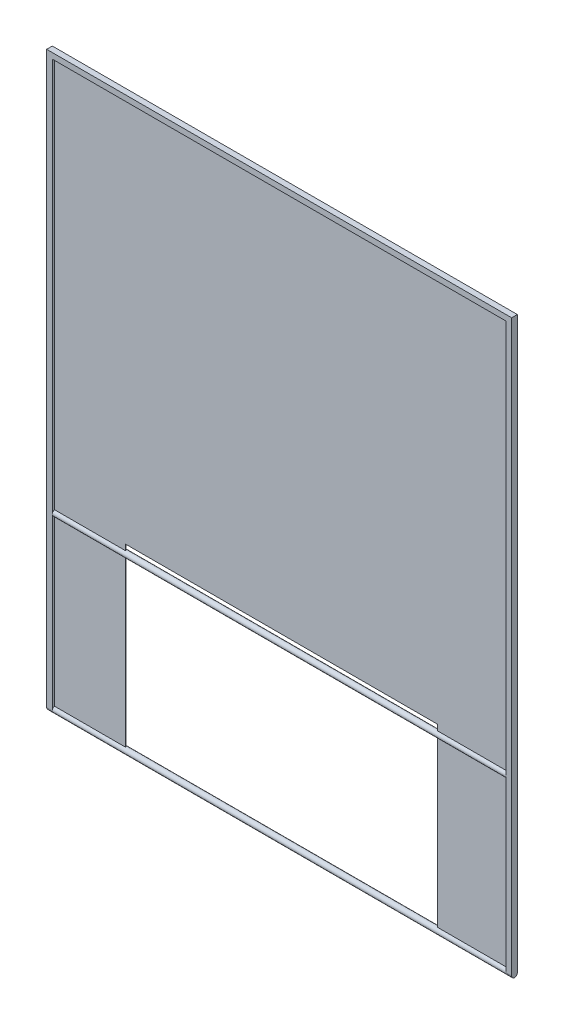
ISO-10303-21;
HEADER;
FILE_DESCRIPTION(('STEP AP214'),'2;1');
FILE_NAME('part.step','',(''),(''),'','','');
FILE_SCHEMA(('AUTOMOTIVE_DESIGN { 1 0 10303 214 1 1 1 1 }'));
ENDSEC;
DATA;
#1=APPLICATION_CONTEXT('core data for automotive mechanical design processes');
#2=APPLICATION_PROTOCOL_DEFINITION('international standard','automotive_design',2000,#1);
#3=PRODUCT_CONTEXT('',#1,'mechanical');
#4=PRODUCT('Part','Part','',(#3));
#5=PRODUCT_RELATED_PRODUCT_CATEGORY('part','',(#4));
#6=PRODUCT_DEFINITION_FORMATION('','',#4);
#7=PRODUCT_DEFINITION_CONTEXT('part definition',#1,'design');
#8=PRODUCT_DEFINITION('design','',#6,#7);
#9=PRODUCT_DEFINITION_SHAPE('','',#8);
#10=(LENGTH_UNIT() NAMED_UNIT(*) SI_UNIT(.MILLI.,.METRE.));
#11=(NAMED_UNIT(*) PLANE_ANGLE_UNIT() SI_UNIT($,.RADIAN.));
#12=(NAMED_UNIT(*) SI_UNIT($,.STERADIAN.) SOLID_ANGLE_UNIT());
#13=UNCERTAINTY_MEASURE_WITH_UNIT(LENGTH_MEASURE(1.E-05),#10,'distance_accuracy_value','');
#14=(GEOMETRIC_REPRESENTATION_CONTEXT(3) GLOBAL_UNCERTAINTY_ASSIGNED_CONTEXT((#13)) GLOBAL_UNIT_ASSIGNED_CONTEXT((#10,
#11,#12)) REPRESENTATION_CONTEXT('',''));
#15=CARTESIAN_POINT('',(0.,0.,0.));
#16=DIRECTION('',(0.,0.,1.));
#17=DIRECTION('',(1.,0.,0.));
#18=AXIS2_PLACEMENT_3D('',#15,#16,#17);
#19=CARTESIAN_POINT('',(-400.,995.,5.));
#20=DIRECTION('',(1.,0.,0.));
#21=DIRECTION('',(0.,0.,-1.));
#22=AXIS2_PLACEMENT_3D('',#19,#20,#21);
#23=PLANE('',#22);
#24=DIRECTION('',(0.,0.,-1.));
#25=VECTOR('',#24,1.);
#26=CARTESIAN_POINT('',(-400.,995.,5.));
#27=LINE('',#26,#25);
#28=CARTESIAN_POINT('',(-400.,995.,0.));
#29=VERTEX_POINT('',#28);
#30=CARTESIAN_POINT('',(-400.,995.,-5.));
#31=VERTEX_POINT('',#30);
#32=EDGE_CURVE('E433',#29,#31,#27,.T.);
#33=ORIENTED_EDGE('',*,*,#32,.F.);
#34=DIRECTION('',(0.,-1.,0.));
#35=VECTOR('',#34,1.);
#36=CARTESIAN_POINT('',(-400.,995.,0.));
#37=LINE('',#36,#35);
#38=CARTESIAN_POINT('',(-400.,305.,0.));
#39=VERTEX_POINT('',#38);
#40=EDGE_CURVE('E302',#29,#39,#37,.T.);
#41=ORIENTED_EDGE('',*,*,#40,.T.);
#42=CARTESIAN_POINT('',(-400.,300.,0.));
#43=DIRECTION('',(1.,0.,0.));
#44=DIRECTION('',(0.,0.,-1.));
#45=AXIS2_PLACEMENT_3D('',#42,#43,#44);
#46=CIRCLE('',#45,5.);
#47=CARTESIAN_POINT('',(-400.,300.,-5.));
#48=VERTEX_POINT('',#47);
#49=EDGE_CURVE('E354',#48,#39,#46,.T.);
#50=ORIENTED_EDGE('',*,*,#49,.F.);
#51=DIRECTION('',(0.,-1.,0.));
#52=VECTOR('',#51,1.);
#53=CARTESIAN_POINT('',(-400.,995.,-5.));
#54=LINE('',#53,#52);
#55=EDGE_CURVE('E402',#31,#48,#54,.T.);
#56=ORIENTED_EDGE('',*,*,#55,.F.);
#57=EDGE_LOOP('',(#33,#41,#50,#56));
#58=FACE_BOUND('',#57,.T.);
#59=ADVANCED_FACE('F51',(#58),#23,.T.);
#60=CARTESIAN_POINT('',(400.,-5.,5.));
#61=DIRECTION('',(-1.,0.,0.));
#62=DIRECTION('',(0.,0.,1.));
#63=AXIS2_PLACEMENT_3D('',#60,#61,#62);
#64=PLANE('',#63);
#65=CARTESIAN_POINT('',(400.,300.,0.));
#66=DIRECTION('',(1.,0.,0.));
#67=DIRECTION('',(0.,0.,-1.));
#68=AXIS2_PLACEMENT_3D('',#65,#66,#67);
#69=CIRCLE('',#68,5.);
#70=CARTESIAN_POINT('',(400.,300.,-5.));
#71=VERTEX_POINT('',#70);
#72=CARTESIAN_POINT('',(400.,305.,0.));
#73=VERTEX_POINT('',#72);
#74=EDGE_CURVE('E362',#71,#73,#69,.T.);
#75=ORIENTED_EDGE('',*,*,#74,.T.);
#76=DIRECTION('',(0.,1.,0.));
#77=VECTOR('',#76,1.);
#78=CARTESIAN_POINT('',(400.,-5.,0.));
#79=LINE('',#78,#77);
#80=CARTESIAN_POINT('',(400.,995.,0.));
#81=VERTEX_POINT('',#80);
#82=EDGE_CURVE('E293',#73,#81,#79,.T.);
#83=ORIENTED_EDGE('',*,*,#82,.T.);
#84=DIRECTION('',(0.,0.,-1.));
#85=VECTOR('',#84,1.);
#86=CARTESIAN_POINT('',(400.,995.,5.));
#87=LINE('',#86,#85);
#88=CARTESIAN_POINT('',(400.,995.,-5.));
#89=VERTEX_POINT('',#88);
#90=EDGE_CURVE('E428',#81,#89,#87,.T.);
#91=ORIENTED_EDGE('',*,*,#90,.T.);
#92=DIRECTION('',(0.,1.,0.));
#93=VECTOR('',#92,1.);
#94=CARTESIAN_POINT('',(400.,-5.,-5.));
#95=LINE('',#94,#93);
#96=EDGE_CURVE('E411',#71,#89,#95,.T.);
#97=ORIENTED_EDGE('',*,*,#96,.F.);
#98=EDGE_LOOP('',(#75,#83,#91,#97));
#99=FACE_BOUND('',#98,.T.);
#100=ADVANCED_FACE('F565',(#99),#64,.T.);
#101=CARTESIAN_POINT('',(-400.,295.,0.));
#102=VERTEX_POINT('',#101);
#103=EDGE_CURVE('E360',#102,#48,#46,.T.);
#104=ORIENTED_EDGE('',*,*,#103,.F.);
#105=DIRECTION('',(0.,-1.,0.));
#106=VECTOR('',#105,1.);
#107=CARTESIAN_POINT('',(-400.,995.,0.));
#108=LINE('',#107,#106);
#109=CARTESIAN_POINT('',(-400.,5.,0.));
#110=VERTEX_POINT('',#109);
#111=EDGE_CURVE('E76',#102,#110,#108,.T.);
#112=ORIENTED_EDGE('',*,*,#111,.T.);
#113=CARTESIAN_POINT('',(-400.,0.,0.));
#114=DIRECTION('',(1.,0.,0.));
#115=DIRECTION('',(0.,0.,-1.));
#116=AXIS2_PLACEMENT_3D('',#113,#114,#115);
#117=CIRCLE('',#116,5.);
#118=CARTESIAN_POINT('',(-400.,0.,-5.));
#119=VERTEX_POINT('',#118);
#120=EDGE_CURVE('E442',#119,#110,#117,.T.);
#121=ORIENTED_EDGE('',*,*,#120,.F.);
#122=EDGE_CURVE('E407',#48,#119,#54,.T.);
#123=ORIENTED_EDGE('',*,*,#122,.F.);
#124=EDGE_LOOP('',(#104,#112,#121,#123));
#125=FACE_BOUND('',#124,.T.);
#126=ADVANCED_FACE('F536',(#125),#23,.T.);
#127=CARTESIAN_POINT('',(400.,995.,5.));
#128=DIRECTION('',(0.,-1.,0.));
#129=DIRECTION('',(1.,0.,0.));
#130=AXIS2_PLACEMENT_3D('',#127,#128,#129);
#131=PLANE('',#130);
#132=ORIENTED_EDGE('',*,*,#90,.F.);
#133=DIRECTION('',(-1.,0.,0.));
#134=VECTOR('',#133,1.);
#135=CARTESIAN_POINT('',(400.,995.,0.));
#136=LINE('',#135,#134);
#137=EDGE_CURVE('E298',#81,#29,#136,.T.);
#138=ORIENTED_EDGE('',*,*,#137,.T.);
#139=ORIENTED_EDGE('',*,*,#32,.T.);
#140=DIRECTION('',(-1.,0.,0.));
#141=VECTOR('',#140,1.);
#142=CARTESIAN_POINT('',(400.,995.,-5.));
#143=LINE('',#142,#141);
#144=EDGE_CURVE('E406',#89,#31,#143,.T.);
#145=ORIENTED_EDGE('',*,*,#144,.F.);
#146=EDGE_LOOP('',(#132,#138,#139,#145));
#147=FACE_BOUND('',#146,.T.);
#148=ADVANCED_FACE('F543',(#147),#131,.T.);
#149=CARTESIAN_POINT('',(400.,0.,0.));
#150=DIRECTION('',(1.,0.,0.));
#151=DIRECTION('',(0.,0.,-1.));
#152=AXIS2_PLACEMENT_3D('',#149,#150,#151);
#153=CIRCLE('',#152,5.);
#154=CARTESIAN_POINT('',(400.,0.,-5.));
#155=VERTEX_POINT('',#154);
#156=CARTESIAN_POINT('',(400.,5.,0.));
#157=VERTEX_POINT('',#156);
#158=EDGE_CURVE('E449',#155,#157,#153,.T.);
#159=ORIENTED_EDGE('',*,*,#158,.T.);
#160=DIRECTION('',(0.,1.,0.));
#161=VECTOR('',#160,1.);
#162=CARTESIAN_POINT('',(400.,-5.,0.));
#163=LINE('',#162,#161);
#164=CARTESIAN_POINT('',(400.,295.,0.));
#165=VERTEX_POINT('',#164);
#166=EDGE_CURVE('E317',#157,#165,#163,.T.);
#167=ORIENTED_EDGE('',*,*,#166,.T.);
#168=EDGE_CURVE('E358',#165,#71,#69,.T.);
#169=ORIENTED_EDGE('',*,*,#168,.T.);
#170=EDGE_CURVE('E415',#155,#71,#95,.T.);
#171=ORIENTED_EDGE('',*,*,#170,.F.);
#172=EDGE_LOOP('',(#159,#167,#169,#171));
#173=FACE_BOUND('',#172,.T.);
#174=ADVANCED_FACE('F561',(#173),#64,.T.);
#175=DIRECTION('',(0.,-1.,0.));
#176=VECTOR('',#175,1.);
#177=CARTESIAN_POINT('',(-400.,995.,1.));
#178=LINE('',#177,#176);
#179=CARTESIAN_POINT('',(-400.,995.,1.));
#180=VERTEX_POINT('',#179);
#181=CARTESIAN_POINT('',(-400.,304.898979485566,1.));
#182=VERTEX_POINT('',#181);
#183=EDGE_CURVE('E330',#180,#182,#178,.T.);
#184=ORIENTED_EDGE('',*,*,#183,.F.);
#185=CARTESIAN_POINT('',(-400.,995.,5.));
#186=VERTEX_POINT('',#185);
#187=EDGE_CURVE('E434',#186,#180,#27,.T.);
#188=ORIENTED_EDGE('',*,*,#187,.F.);
#189=DIRECTION('',(0.,-1.,0.));
#190=VECTOR('',#189,1.);
#191=CARTESIAN_POINT('',(-400.,995.,5.));
#192=LINE('',#191,#190);
#193=CARTESIAN_POINT('',(-400.,300.,5.));
#194=VERTEX_POINT('',#193);
#195=EDGE_CURVE('E375',#186,#194,#192,.T.);
#196=ORIENTED_EDGE('',*,*,#195,.T.);
#197=EDGE_CURVE('E359',#182,#194,#46,.T.);
#198=ORIENTED_EDGE('',*,*,#197,.F.);
#199=EDGE_LOOP('',(#184,#188,#196,#198));
#200=FACE_BOUND('',#199,.T.);
#201=ADVANCED_FACE('F651',(#200),#23,.T.);
#202=DIRECTION('',(0.,1.,0.));
#203=VECTOR('',#202,1.);
#204=CARTESIAN_POINT('',(400.,-5.,1.));
#205=LINE('',#204,#203);
#206=CARTESIAN_POINT('',(400.,304.898979485566,1.));
#207=VERTEX_POINT('',#206);
#208=CARTESIAN_POINT('',(400.,995.,1.));
#209=VERTEX_POINT('',#208);
#210=EDGE_CURVE('E324',#207,#209,#205,.T.);
#211=ORIENTED_EDGE('',*,*,#210,.F.);
#212=CARTESIAN_POINT('',(400.,300.,5.));
#213=VERTEX_POINT('',#212);
#214=EDGE_CURVE('E367',#207,#213,#69,.T.);
#215=ORIENTED_EDGE('',*,*,#214,.T.);
#216=DIRECTION('',(0.,1.,0.));
#217=VECTOR('',#216,1.);
#218=CARTESIAN_POINT('',(400.,-5.,5.));
#219=LINE('',#218,#217);
#220=CARTESIAN_POINT('',(400.,995.,5.));
#221=VERTEX_POINT('',#220);
#222=EDGE_CURVE('E383',#213,#221,#219,.T.);
#223=ORIENTED_EDGE('',*,*,#222,.T.);
#224=EDGE_CURVE('E429',#221,#209,#87,.T.);
#225=ORIENTED_EDGE('',*,*,#224,.T.);
#226=EDGE_LOOP('',(#211,#215,#223,#225));
#227=FACE_BOUND('',#226,.T.);
#228=ADVANCED_FACE('F659',(#227),#64,.T.);
#229=CARTESIAN_POINT('',(-400.,-5.,-5.));
#230=VERTEX_POINT('',#229);
#231=EDGE_CURVE('E401',#119,#230,#54,.T.);
#232=ORIENTED_EDGE('',*,*,#231,.F.);
#233=CARTESIAN_POINT('',(-400.,-5.,0.));
#234=VERTEX_POINT('',#233);
#235=EDGE_CURVE('E441',#234,#119,#117,.T.);
#236=ORIENTED_EDGE('',*,*,#235,.F.);
#237=DIRECTION('',(0.,0.,-1.));
#238=VECTOR('',#237,1.);
#239=CARTESIAN_POINT('',(-400.,-5.,5.));
#240=LINE('',#239,#238);
#241=EDGE_CURVE('E438',#234,#230,#240,.T.);
#242=ORIENTED_EDGE('',*,*,#241,.T.);
#243=EDGE_LOOP('',(#232,#236,#242));
#244=FACE_BOUND('',#243,.T.);
#245=ADVANCED_FACE('F640',(#244),#23,.T.);
#246=CARTESIAN_POINT('',(-410.,995.,5.));
#247=DIRECTION('',(1.,0.,0.));
#248=DIRECTION('',(0.,0.,-1.));
#249=AXIS2_PLACEMENT_3D('',#246,#247,#248);
#250=PLANE('',#249);
#251=DIRECTION('',(0.,0.,-1.));
#252=VECTOR('',#251,1.);
#253=CARTESIAN_POINT('',(-410.,1005.,5.));
#254=LINE('',#253,#252);
#255=CARTESIAN_POINT('',(-410.,1005.,5.));
#256=VERTEX_POINT('',#255);
#257=CARTESIAN_POINT('',(-410.,1005.,-5.));
#258=VERTEX_POINT('',#257);
#259=EDGE_CURVE('E393',#256,#258,#254,.T.);
#260=ORIENTED_EDGE('',*,*,#259,.T.);
#261=DIRECTION('',(0.,1.,0.));
#262=VECTOR('',#261,1.);
#263=CARTESIAN_POINT('',(-410.,995.,-5.));
#264=LINE('',#263,#262);
#265=CARTESIAN_POINT('',(-410.,0.,-5.));
#266=VERTEX_POINT('',#265);
#267=EDGE_CURVE('E366',#258,#266,#264,.F.);
#268=ORIENTED_EDGE('',*,*,#267,.T.);
#269=DIRECTION('',(0.,0.,-1.));
#270=VECTOR('',#269,1.);
#271=CARTESIAN_POINT('',(-410.,0.,5.));
#272=LINE('',#271,#270);
#273=CARTESIAN_POINT('',(-410.,0.,5.));
#274=VERTEX_POINT('',#273);
#275=EDGE_CURVE('E482',#266,#274,#272,.F.);
#276=ORIENTED_EDGE('',*,*,#275,.T.);
#277=DIRECTION('',(0.,1.,0.));
#278=VECTOR('',#277,1.);
#279=CARTESIAN_POINT('',(-410.,995.,5.));
#280=LINE('',#279,#278);
#281=EDGE_CURVE('E369',#256,#274,#280,.F.);
#282=ORIENTED_EDGE('',*,*,#281,.F.);
#283=EDGE_LOOP('',(#260,#268,#276,#282));
#284=FACE_BOUND('',#283,.T.);
#285=ADVANCED_FACE('F666',(#284),#250,.F.);
#286=CARTESIAN_POINT('',(-400.,-5.,5.));
#287=DIRECTION('',(0.,-1.,0.));
#288=DIRECTION('',(1.,0.,0.));
#289=AXIS2_PLACEMENT_3D('',#286,#287,#288);
#290=PLANE('',#289);
#291=DIRECTION('',(-1.,0.,0.));
#292=VECTOR('',#291,1.);
#293=CARTESIAN_POINT('',(-400.,-5.,0.));
#294=LINE('',#293,#292);
#295=CARTESIAN_POINT('',(-405.,-5.,0.));
#296=VERTEX_POINT('',#295);
#297=EDGE_CURVE('E475',#234,#296,#294,.T.);
#298=ORIENTED_EDGE('',*,*,#297,.T.);
#299=DIRECTION('',(0.,0.,-1.));
#300=VECTOR('',#299,1.);
#301=CARTESIAN_POINT('',(-405.,-5.,-5.));
#302=LINE('',#301,#300);
#303=CARTESIAN_POINT('',(-405.,-5.,-5.));
#304=VERTEX_POINT('',#303);
#305=EDGE_CURVE('E478',#296,#304,#302,.T.);
#306=ORIENTED_EDGE('',*,*,#305,.T.);
#307=DIRECTION('',(-1.,0.,0.));
#308=VECTOR('',#307,1.);
#309=CARTESIAN_POINT('',(-400.,-5.,-5.));
#310=LINE('',#309,#308);
#311=EDGE_CURVE('E397',#230,#304,#310,.T.);
#312=ORIENTED_EDGE('',*,*,#311,.F.);
#313=ORIENTED_EDGE('',*,*,#241,.F.);
#314=EDGE_LOOP('',(#298,#306,#312,#313));
#315=FACE_BOUND('',#314,.T.);
#316=ADVANCED_FACE('F635',(#315),#290,.T.);
#317=DIRECTION('',(0.,-1.,0.));
#318=VECTOR('',#317,1.);
#319=CARTESIAN_POINT('',(-400.,995.,1.));
#320=LINE('',#319,#318);
#321=CARTESIAN_POINT('',(-400.,295.101020514434,1.));
#322=VERTEX_POINT('',#321);
#323=CARTESIAN_POINT('',(-400.,4.89897948556636,1.));
#324=VERTEX_POINT('',#323);
#325=EDGE_CURVE('E336',#322,#324,#320,.T.);
#326=ORIENTED_EDGE('',*,*,#325,.F.);
#327=EDGE_CURVE('E361',#194,#322,#46,.T.);
#328=ORIENTED_EDGE('',*,*,#327,.F.);
#329=CARTESIAN_POINT('',(-400.,0.,5.));
#330=VERTEX_POINT('',#329);
#331=EDGE_CURVE('E373',#194,#330,#192,.T.);
#332=ORIENTED_EDGE('',*,*,#331,.T.);
#333=EDGE_CURVE('E447',#324,#330,#117,.T.);
#334=ORIENTED_EDGE('',*,*,#333,.F.);
#335=EDGE_LOOP('',(#326,#328,#332,#334));
#336=FACE_BOUND('',#335,.T.);
#337=ADVANCED_FACE('F646',(#336),#23,.T.);
#338=DIRECTION('',(-1.,0.,0.));
#339=VECTOR('',#338,1.);
#340=CARTESIAN_POINT('',(400.,995.,1.));
#341=LINE('',#340,#339);
#342=EDGE_CURVE('E327',#209,#180,#341,.T.);
#343=ORIENTED_EDGE('',*,*,#342,.F.);
#344=ORIENTED_EDGE('',*,*,#224,.F.);
#345=DIRECTION('',(-1.,0.,0.));
#346=VECTOR('',#345,1.);
#347=CARTESIAN_POINT('',(400.,995.,5.));
#348=LINE('',#347,#346);
#349=EDGE_CURVE('E379',#221,#186,#348,.T.);
#350=ORIENTED_EDGE('',*,*,#349,.T.);
#351=ORIENTED_EDGE('',*,*,#187,.T.);
#352=EDGE_LOOP('',(#343,#344,#350,#351));
#353=FACE_BOUND('',#352,.T.);
#354=ADVANCED_FACE('F654',(#353),#131,.T.);
#355=DIRECTION('',(0.,1.,0.));
#356=VECTOR('',#355,1.);
#357=CARTESIAN_POINT('',(400.,-5.,1.));
#358=LINE('',#357,#356);
#359=CARTESIAN_POINT('',(400.,4.89897948556636,1.));
#360=VERTEX_POINT('',#359);
#361=CARTESIAN_POINT('',(400.,295.101020514434,1.));
#362=VERTEX_POINT('',#361);
#363=EDGE_CURVE('E344',#360,#362,#358,.T.);
#364=ORIENTED_EDGE('',*,*,#363,.F.);
#365=CARTESIAN_POINT('',(400.,0.,5.));
#366=VERTEX_POINT('',#365);
#367=EDGE_CURVE('E454',#360,#366,#153,.T.);
#368=ORIENTED_EDGE('',*,*,#367,.T.);
#369=EDGE_CURVE('E386',#366,#213,#219,.T.);
#370=ORIENTED_EDGE('',*,*,#369,.T.);
#371=EDGE_CURVE('E368',#213,#362,#69,.T.);
#372=ORIENTED_EDGE('',*,*,#371,.T.);
#373=EDGE_LOOP('',(#364,#368,#370,#372));
#374=FACE_BOUND('',#373,.T.);
#375=ADVANCED_FACE('F593',(#374),#64,.T.);
#376=CARTESIAN_POINT('',(410.,-5.,5.));
#377=DIRECTION('',(-1.,0.,0.));
#378=DIRECTION('',(0.,0.,1.));
#379=AXIS2_PLACEMENT_3D('',#376,#377,#378);
#380=PLANE('',#379);
#381=DIRECTION('',(0.,1.,0.));
#382=VECTOR('',#381,1.);
#383=CARTESIAN_POINT('',(410.,-5.,-5.));
#384=LINE('',#383,#382);
#385=CARTESIAN_POINT('',(410.,0.,-5.));
#386=VERTEX_POINT('',#385);
#387=CARTESIAN_POINT('',(410.,1005.,-5.));
#388=VERTEX_POINT('',#387);
#389=EDGE_CURVE('E416',#386,#388,#384,.T.);
#390=ORIENTED_EDGE('',*,*,#389,.T.);
#391=DIRECTION('',(0.,0.,-1.));
#392=VECTOR('',#391,1.);
#393=CARTESIAN_POINT('',(410.,1005.,5.));
#394=LINE('',#393,#392);
#395=CARTESIAN_POINT('',(410.,1005.,5.));
#396=VERTEX_POINT('',#395);
#397=EDGE_CURVE('E425',#396,#388,#394,.T.);
#398=ORIENTED_EDGE('',*,*,#397,.F.);
#399=DIRECTION('',(0.,1.,0.));
#400=VECTOR('',#399,1.);
#401=CARTESIAN_POINT('',(410.,-5.,5.));
#402=LINE('',#401,#400);
#403=CARTESIAN_POINT('',(410.,0.,5.));
#404=VERTEX_POINT('',#403);
#405=EDGE_CURVE('E387',#404,#396,#402,.T.);
#406=ORIENTED_EDGE('',*,*,#405,.F.);
#407=CARTESIAN_POINT('',(410.,0.,0.));
#408=DIRECTION('',(-1.,0.,0.));
#409=DIRECTION('',(0.,0.,1.));
#410=AXIS2_PLACEMENT_3D('',#407,#408,#409);
#411=CIRCLE('',#410,5.);
#412=CARTESIAN_POINT('',(410.,-5.,0.));
#413=VERTEX_POINT('',#412);
#414=EDGE_CURVE('E462',#404,#413,#411,.F.);
#415=ORIENTED_EDGE('',*,*,#414,.T.);
#416=CARTESIAN_POINT('',(410.,0.,0.));
#417=DIRECTION('',(-1.,0.,0.));
#418=DIRECTION('',(0.,0.,1.));
#419=AXIS2_PLACEMENT_3D('',#416,#417,#418);
#420=CIRCLE('',#419,5.);
#421=EDGE_CURVE('E465',#413,#386,#420,.F.);
#422=ORIENTED_EDGE('',*,*,#421,.T.);
#423=EDGE_LOOP('',(#390,#398,#406,#415,#422));
#424=FACE_BOUND('',#423,.T.);
#425=ADVANCED_FACE('F615',(#424),#380,.F.);
#426=CARTESIAN_POINT('',(400.,1005.,5.));
#427=DIRECTION('',(0.,-1.,0.));
#428=DIRECTION('',(1.,0.,0.));
#429=AXIS2_PLACEMENT_3D('',#426,#427,#428);
#430=PLANE('',#429);
#431=ORIENTED_EDGE('',*,*,#397,.T.);
#432=DIRECTION('',(-1.,0.,0.));
#433=VECTOR('',#432,1.);
#434=CARTESIAN_POINT('',(400.,1005.,-5.));
#435=LINE('',#434,#433);
#436=EDGE_CURVE('E374',#388,#258,#435,.T.);
#437=ORIENTED_EDGE('',*,*,#436,.T.);
#438=ORIENTED_EDGE('',*,*,#259,.F.);
#439=DIRECTION('',(-1.,0.,0.));
#440=VECTOR('',#439,1.);
#441=CARTESIAN_POINT('',(400.,1005.,5.));
#442=LINE('',#441,#440);
#443=EDGE_CURVE('E390',#396,#256,#442,.T.);
#444=ORIENTED_EDGE('',*,*,#443,.F.);
#445=EDGE_LOOP('',(#431,#437,#438,#444));
#446=FACE_BOUND('',#445,.T.);
#447=ADVANCED_FACE('F620',(#446),#430,.F.);
#448=CARTESIAN_POINT('',(0.,0.,5.));
#449=DIRECTION('',(0.,0.,1.));
#450=DIRECTION('',(1.,0.,0.));
#451=AXIS2_PLACEMENT_3D('',#448,#449,#450);
#452=PLANE('',#451);
#453=ORIENTED_EDGE('',*,*,#369,.F.);
#454=DIRECTION('',(-1.,0.,0.));
#455=VECTOR('',#454,1.);
#456=CARTESIAN_POINT('',(0.,0.,5.));
#457=LINE('',#456,#455);
#458=EDGE_CURVE('E472',#366,#404,#457,.F.);
#459=ORIENTED_EDGE('',*,*,#458,.T.);
#460=ORIENTED_EDGE('',*,*,#405,.T.);
#461=ORIENTED_EDGE('',*,*,#443,.T.);
#462=ORIENTED_EDGE('',*,*,#281,.T.);
#463=DIRECTION('',(-1.,0.,0.));
#464=VECTOR('',#463,1.);
#465=CARTESIAN_POINT('',(0.,0.,5.));
#466=LINE('',#465,#464);
#467=EDGE_CURVE('E468',#274,#330,#466,.F.);
#468=ORIENTED_EDGE('',*,*,#467,.T.);
#469=ORIENTED_EDGE('',*,*,#331,.F.);
#470=ORIENTED_EDGE('',*,*,#195,.F.);
#471=ORIENTED_EDGE('',*,*,#349,.F.);
#472=ORIENTED_EDGE('',*,*,#222,.F.);
#473=EDGE_LOOP('',(#453,#459,#460,#461,#462,#468,#469,#470,#471,#472));
#474=FACE_BOUND('',#473,.T.);
#475=ADVANCED_FACE('F611',(#474),#452,.T.);
#476=CARTESIAN_POINT('',(0.,0.,-5.));
#477=DIRECTION('',(0.,0.,1.));
#478=DIRECTION('',(1.,0.,0.));
#479=AXIS2_PLACEMENT_3D('',#476,#477,#478);
#480=PLANE('',#479);
#481=ORIENTED_EDGE('',*,*,#389,.F.);
#482=DIRECTION('',(-1.,0.,0.));
#483=VECTOR('',#482,1.);
#484=CARTESIAN_POINT('',(400.,0.,-5.));
#485=LINE('',#484,#483);
#486=EDGE_CURVE('E458',#386,#155,#485,.T.);
#487=ORIENTED_EDGE('',*,*,#486,.T.);
#488=ORIENTED_EDGE('',*,*,#170,.T.);
#489=ORIENTED_EDGE('',*,*,#96,.T.);
#490=ORIENTED_EDGE('',*,*,#144,.T.);
#491=ORIENTED_EDGE('',*,*,#55,.T.);
#492=ORIENTED_EDGE('',*,*,#122,.T.);
#493=ORIENTED_EDGE('',*,*,#231,.T.);
#494=ORIENTED_EDGE('',*,*,#311,.T.);
#495=CARTESIAN_POINT('',(-405.,0.,-5.));
#496=DIRECTION('',(0.,0.,1.));
#497=DIRECTION('',(1.,0.,0.));
#498=AXIS2_PLACEMENT_3D('',#495,#496,#497);
#499=CIRCLE('',#498,5.);
#500=EDGE_CURVE('E453',#304,#266,#499,.F.);
#501=ORIENTED_EDGE('',*,*,#500,.T.);
#502=ORIENTED_EDGE('',*,*,#267,.F.);
#503=ORIENTED_EDGE('',*,*,#436,.F.);
#504=EDGE_LOOP('',(#481,#487,#488,#489,#490,#491,#492,#493,#494,#501,#502,#503));
#505=FACE_BOUND('',#504,.T.);
#506=ADVANCED_FACE('F530',(#505),#480,.F.);
#507=CARTESIAN_POINT('',(-400.,0.,0.));
#508=DIRECTION('',(1.,0.,0.));
#509=DIRECTION('',(0.,0.,-1.));
#510=AXIS2_PLACEMENT_3D('',#507,#508,#509);
#511=CYLINDRICAL_SURFACE('',#510,5.);
#512=DIRECTION('',(1.,0.,0.));
#513=VECTOR('',#512,1.);
#514=CARTESIAN_POINT('',(-400.,4.89897948556636,1.));
#515=LINE('',#514,#513);
#516=CARTESIAN_POINT('',(-275.,4.89897948556633,1.));
#517=VERTEX_POINT('',#516);
#518=EDGE_CURVE('E340',#324,#517,#515,.T.);
#519=ORIENTED_EDGE('',*,*,#518,.F.);
#520=ORIENTED_EDGE('',*,*,#333,.T.);
#521=EDGE_CURVE('E448',#330,#234,#117,.T.);
#522=ORIENTED_EDGE('',*,*,#521,.T.);
#523=ORIENTED_EDGE('',*,*,#235,.T.);
#524=ORIENTED_EDGE('',*,*,#120,.T.);
#525=DIRECTION('',(1.,0.,0.));
#526=VECTOR('',#525,1.);
#527=CARTESIAN_POINT('',(-400.,5.,0.));
#528=LINE('',#527,#526);
#529=CARTESIAN_POINT('',(-275.,5.,0.));
#530=VERTEX_POINT('',#529);
#531=EDGE_CURVE('E312',#110,#530,#528,.T.);
#532=ORIENTED_EDGE('',*,*,#531,.T.);
#533=CARTESIAN_POINT('',(-275.,0.,0.));
#534=DIRECTION('',(1.,0.,0.));
#535=DIRECTION('',(0.,0.,-1.));
#536=AXIS2_PLACEMENT_3D('',#533,#534,#535);
#537=CIRCLE('',#536,5.);
#538=EDGE_CURVE('E350',#517,#530,#537,.F.);
#539=ORIENTED_EDGE('',*,*,#538,.F.);
#540=EDGE_LOOP('',(#519,#520,#522,#523,#524,#532,#539));
#541=FACE_BOUND('',#540,.T.);
#542=CARTESIAN_POINT('',(275.,4.89897948556636,1.));
#543=VERTEX_POINT('',#542);
#544=EDGE_CURVE('E343',#543,#360,#515,.T.);
#545=ORIENTED_EDGE('',*,*,#544,.F.);
#546=CARTESIAN_POINT('',(275.,0.,0.));
#547=DIRECTION('',(-1.,0.,0.));
#548=DIRECTION('',(0.,0.,1.));
#549=AXIS2_PLACEMENT_3D('',#546,#547,#548);
#550=CIRCLE('',#549,5.);
#551=CARTESIAN_POINT('',(275.,5.,0.));
#552=VERTEX_POINT('',#551);
#553=EDGE_CURVE('E347',#552,#543,#550,.F.);
#554=ORIENTED_EDGE('',*,*,#553,.F.);
#555=EDGE_CURVE('E316',#552,#157,#528,.T.);
#556=ORIENTED_EDGE('',*,*,#555,.T.);
#557=ORIENTED_EDGE('',*,*,#158,.F.);
#558=CARTESIAN_POINT('',(400.,-5.,0.));
#559=VERTEX_POINT('',#558);
#560=EDGE_CURVE('E446',#559,#155,#153,.T.);
#561=ORIENTED_EDGE('',*,*,#560,.F.);
#562=EDGE_CURVE('E455',#366,#559,#153,.T.);
#563=ORIENTED_EDGE('',*,*,#562,.F.);
#564=ORIENTED_EDGE('',*,*,#367,.F.);
#565=EDGE_LOOP('',(#545,#554,#556,#557,#561,#563,#564));
#566=FACE_BOUND('',#565,.T.);
#567=ADVANCED_FACE('F595',(#541,#566),#511,.T.);
#568=CARTESIAN_POINT('',(-400.,300.,0.));
#569=DIRECTION('',(1.,0.,0.));
#570=DIRECTION('',(0.,0.,-1.));
#571=AXIS2_PLACEMENT_3D('',#568,#569,#570);
#572=CYLINDRICAL_SURFACE('',#571,5.);
#573=DIRECTION('',(1.,0.,0.));
#574=VECTOR('',#573,1.);
#575=CARTESIAN_POINT('',(-400.,295.101020514434,1.));
#576=LINE('',#575,#574);
#577=CARTESIAN_POINT('',(275.,295.101020514434,1.));
#578=VERTEX_POINT('',#577);
#579=EDGE_CURVE('E337',#362,#578,#576,.F.);
#580=ORIENTED_EDGE('',*,*,#579,.F.);
#581=ORIENTED_EDGE('',*,*,#371,.F.);
#582=ORIENTED_EDGE('',*,*,#214,.F.);
#583=DIRECTION('',(1.,0.,0.));
#584=VECTOR('',#583,1.);
#585=CARTESIAN_POINT('',(-400.,304.898979485566,1.));
#586=LINE('',#585,#584);
#587=CARTESIAN_POINT('',(275.,304.898979485566,1.));
#588=VERTEX_POINT('',#587);
#589=EDGE_CURVE('E321',#588,#207,#586,.T.);
#590=ORIENTED_EDGE('',*,*,#589,.F.);
#591=CARTESIAN_POINT('',(275.,300.,0.));
#592=DIRECTION('',(-1.,0.,0.));
#593=DIRECTION('',(0.,0.,1.));
#594=AXIS2_PLACEMENT_3D('',#591,#592,#593);
#595=CIRCLE('',#594,5.);
#596=CARTESIAN_POINT('',(275.,305.,0.));
#597=VERTEX_POINT('',#596);
#598=EDGE_CURVE('E62',#597,#588,#595,.F.);
#599=ORIENTED_EDGE('',*,*,#598,.F.);
#600=DIRECTION('',(1.,0.,0.));
#601=VECTOR('',#600,1.);
#602=CARTESIAN_POINT('',(-400.,305.,0.));
#603=LINE('',#602,#601);
#604=EDGE_CURVE('E256',#597,#73,#603,.T.);
#605=ORIENTED_EDGE('',*,*,#604,.T.);
#606=ORIENTED_EDGE('',*,*,#74,.F.);
#607=ORIENTED_EDGE('',*,*,#168,.F.);
#608=DIRECTION('',(1.,0.,0.));
#609=VECTOR('',#608,1.);
#610=CARTESIAN_POINT('',(-400.,295.,0.));
#611=LINE('',#610,#609);
#612=CARTESIAN_POINT('',(275.,295.,0.));
#613=VERTEX_POINT('',#612);
#614=EDGE_CURVE('E309',#165,#613,#611,.F.);
#615=ORIENTED_EDGE('',*,*,#614,.T.);
#616=EDGE_CURVE('E12',#578,#613,#595,.F.);
#617=ORIENTED_EDGE('',*,*,#616,.F.);
#618=EDGE_LOOP('',(#580,#581,#582,#590,#599,#605,#606,#607,#615,#617));
#619=FACE_BOUND('',#618,.T.);
#620=CARTESIAN_POINT('',(-275.,295.101020514434,1.));
#621=VERTEX_POINT('',#620);
#622=EDGE_CURVE('E333',#621,#322,#576,.F.);
#623=ORIENTED_EDGE('',*,*,#622,.F.);
#624=CARTESIAN_POINT('',(-275.,300.,0.));
#625=DIRECTION('',(1.,0.,0.));
#626=DIRECTION('',(0.,0.,-1.));
#627=AXIS2_PLACEMENT_3D('',#624,#625,#626);
#628=CIRCLE('',#627,5.);
#629=CARTESIAN_POINT('',(-275.,295.,0.));
#630=VERTEX_POINT('',#629);
#631=EDGE_CURVE('E61',#630,#621,#628,.F.);
#632=ORIENTED_EDGE('',*,*,#631,.F.);
#633=EDGE_CURVE('E306',#630,#102,#611,.F.);
#634=ORIENTED_EDGE('',*,*,#633,.T.);
#635=ORIENTED_EDGE('',*,*,#103,.T.);
#636=ORIENTED_EDGE('',*,*,#49,.T.);
#637=CARTESIAN_POINT('',(-275.,305.,0.));
#638=VERTEX_POINT('',#637);
#639=EDGE_CURVE('E294',#39,#638,#603,.T.);
#640=ORIENTED_EDGE('',*,*,#639,.T.);
#641=CARTESIAN_POINT('',(-275.,304.898979485566,1.));
#642=VERTEX_POINT('',#641);
#643=EDGE_CURVE('E55',#642,#638,#628,.F.);
#644=ORIENTED_EDGE('',*,*,#643,.F.);
#645=EDGE_CURVE('E265',#182,#642,#586,.T.);
#646=ORIENTED_EDGE('',*,*,#645,.F.);
#647=ORIENTED_EDGE('',*,*,#197,.T.);
#648=ORIENTED_EDGE('',*,*,#327,.T.);
#649=EDGE_LOOP('',(#623,#632,#634,#635,#636,#640,#644,#646,#647,#648));
#650=FACE_BOUND('',#649,.T.);
#651=ADVANCED_FACE('F513',(#619,#650),#572,.T.);
#652=CARTESIAN_POINT('',(410.,0.,0.));
#653=DIRECTION('',(-1.,0.,0.));
#654=DIRECTION('',(0.,0.,1.));
#655=AXIS2_PLACEMENT_3D('',#652,#653,#654);
#656=CYLINDRICAL_SURFACE('',#655,5.);
#657=DIRECTION('',(-1.,0.,0.));
#658=VECTOR('',#657,1.);
#659=CARTESIAN_POINT('',(410.,-5.,0.));
#660=LINE('',#659,#658);
#661=EDGE_CURVE('E485',#413,#559,#660,.T.);
#662=ORIENTED_EDGE('',*,*,#661,.F.);
#663=ORIENTED_EDGE('',*,*,#414,.F.);
#664=ORIENTED_EDGE('',*,*,#458,.F.);
#665=ORIENTED_EDGE('',*,*,#562,.T.);
#666=EDGE_LOOP('',(#662,#663,#664,#665));
#667=FACE_BOUND('',#666,.T.);
#668=ADVANCED_FACE('F607',(#667),#656,.T.);
#669=CARTESIAN_POINT('',(0.,0.,0.));
#670=DIRECTION('',(1.,0.,0.));
#671=DIRECTION('',(0.,0.,-1.));
#672=AXIS2_PLACEMENT_3D('',#669,#670,#671);
#673=CYLINDRICAL_SURFACE('',#672,5.);
#674=ORIENTED_EDGE('',*,*,#421,.F.);
#675=ORIENTED_EDGE('',*,*,#661,.T.);
#676=ORIENTED_EDGE('',*,*,#560,.T.);
#677=ORIENTED_EDGE('',*,*,#486,.F.);
#678=EDGE_LOOP('',(#674,#675,#676,#677));
#679=FACE_BOUND('',#678,.T.);
#680=ADVANCED_FACE('F603',(#679),#673,.T.);
#681=CARTESIAN_POINT('',(-400.,0.,0.));
#682=DIRECTION('',(-1.,0.,0.));
#683=DIRECTION('',(0.,-1.,0.));
#684=AXIS2_PLACEMENT_3D('',#681,#682,#683);
#685=CYLINDRICAL_SURFACE('',#684,5.);
#686=ORIENTED_EDGE('',*,*,#521,.F.);
#687=ORIENTED_EDGE('',*,*,#467,.F.);
#688=CARTESIAN_POINT('',(-405.,0.,0.));
#689=DIRECTION('',(-0.707106781186547,0.,-0.707106781186547));
#690=DIRECTION('',(-0.707106781186547,0.,0.707106781186547));
#691=AXIS2_PLACEMENT_3D('',#688,#689,#690);
#692=ELLIPSE('',#691,7.07106781186547,5.);
#693=EDGE_CURVE('E353',#296,#274,#692,.T.);
#694=ORIENTED_EDGE('',*,*,#693,.F.);
#695=ORIENTED_EDGE('',*,*,#297,.F.);
#696=EDGE_LOOP('',(#686,#687,#694,#695));
#697=FACE_BOUND('',#696,.T.);
#698=ADVANCED_FACE('F53',(#697),#685,.T.);
#699=CARTESIAN_POINT('',(-405.,0.,5.));
#700=DIRECTION('',(0.,0.,1.));
#701=DIRECTION('',(1.,0.,0.));
#702=AXIS2_PLACEMENT_3D('',#699,#700,#701);
#703=CYLINDRICAL_SURFACE('',#702,5.);
#704=ORIENTED_EDGE('',*,*,#693,.T.);
#705=ORIENTED_EDGE('',*,*,#275,.F.);
#706=ORIENTED_EDGE('',*,*,#500,.F.);
#707=ORIENTED_EDGE('',*,*,#305,.F.);
#708=EDGE_LOOP('',(#704,#705,#706,#707));
#709=FACE_BOUND('',#708,.T.);
#710=ADVANCED_FACE('F632',(#709),#703,.T.);
#711=CARTESIAN_POINT('',(0.,0.,0.));
#712=DIRECTION('',(0.,0.,1.));
#713=DIRECTION('',(1.,0.,0.));
#714=AXIS2_PLACEMENT_3D('',#711,#712,#713);
#715=PLANE('',#714);
#716=ORIENTED_EDGE('',*,*,#639,.F.);
#717=ORIENTED_EDGE('',*,*,#40,.F.);
#718=ORIENTED_EDGE('',*,*,#137,.F.);
#719=ORIENTED_EDGE('',*,*,#82,.F.);
#720=ORIENTED_EDGE('',*,*,#604,.F.);
#721=DIRECTION('',(0.,1.,0.));
#722=VECTOR('',#721,1.);
#723=CARTESIAN_POINT('',(275.,0.,0.));
#724=LINE('',#723,#722);
#725=CARTESIAN_POINT('',(275.,315.,0.));
#726=VERTEX_POINT('',#725);
#727=EDGE_CURVE('E285',#597,#726,#724,.T.);
#728=ORIENTED_EDGE('',*,*,#727,.T.);
#729=DIRECTION('',(-1.,0.,0.));
#730=VECTOR('',#729,1.);
#731=CARTESIAN_POINT('',(275.,315.,0.));
#732=LINE('',#731,#730);
#733=CARTESIAN_POINT('',(-275.,315.,0.));
#734=VERTEX_POINT('',#733);
#735=EDGE_CURVE('E281',#726,#734,#732,.T.);
#736=ORIENTED_EDGE('',*,*,#735,.T.);
#737=DIRECTION('',(0.,-1.,0.));
#738=VECTOR('',#737,1.);
#739=CARTESIAN_POINT('',(-275.,315.,0.));
#740=LINE('',#739,#738);
#741=EDGE_CURVE('E250',#734,#638,#740,.T.);
#742=ORIENTED_EDGE('',*,*,#741,.T.);
#743=EDGE_LOOP('',(#716,#717,#718,#719,#720,#728,#736,#742));
#744=FACE_BOUND('',#743,.T.);
#745=ADVANCED_FACE('F540',(#744),#715,.F.);
#746=CARTESIAN_POINT('',(0.,0.,1.));
#747=DIRECTION('',(0.,0.,1.));
#748=DIRECTION('',(1.,0.,0.));
#749=AXIS2_PLACEMENT_3D('',#746,#747,#748);
#750=PLANE('',#749);
#751=ORIENTED_EDGE('',*,*,#183,.T.);
#752=ORIENTED_EDGE('',*,*,#645,.T.);
#753=DIRECTION('',(0.,-1.,0.));
#754=VECTOR('',#753,1.);
#755=CARTESIAN_POINT('',(-275.,315.,1.));
#756=LINE('',#755,#754);
#757=CARTESIAN_POINT('',(-275.,315.,1.));
#758=VERTEX_POINT('',#757);
#759=EDGE_CURVE('E247',#758,#642,#756,.T.);
#760=ORIENTED_EDGE('',*,*,#759,.F.);
#761=DIRECTION('',(-1.,0.,0.));
#762=VECTOR('',#761,1.);
#763=CARTESIAN_POINT('',(275.,315.,1.));
#764=LINE('',#763,#762);
#765=CARTESIAN_POINT('',(275.,315.,1.));
#766=VERTEX_POINT('',#765);
#767=EDGE_CURVE('E263',#766,#758,#764,.T.);
#768=ORIENTED_EDGE('',*,*,#767,.F.);
#769=DIRECTION('',(0.,1.,0.));
#770=VECTOR('',#769,1.);
#771=CARTESIAN_POINT('',(275.,0.,1.));
#772=LINE('',#771,#770);
#773=EDGE_CURVE('E273',#588,#766,#772,.T.);
#774=ORIENTED_EDGE('',*,*,#773,.F.);
#775=ORIENTED_EDGE('',*,*,#589,.T.);
#776=ORIENTED_EDGE('',*,*,#210,.T.);
#777=ORIENTED_EDGE('',*,*,#342,.T.);
#778=EDGE_LOOP('',(#751,#752,#760,#768,#774,#775,#776,#777));
#779=FACE_BOUND('',#778,.T.);
#780=ADVANCED_FACE('F261',(#779),#750,.T.);
#781=CARTESIAN_POINT('',(275.,0.,1.));
#782=DIRECTION('',(-1.,0.,0.));
#783=DIRECTION('',(0.,0.,1.));
#784=AXIS2_PLACEMENT_3D('',#781,#782,#783);
#785=PLANE('',#784);
#786=ORIENTED_EDGE('',*,*,#727,.F.);
#787=ORIENTED_EDGE('',*,*,#598,.T.);
#788=ORIENTED_EDGE('',*,*,#773,.T.);
#789=DIRECTION('',(0.,0.,-1.));
#790=VECTOR('',#789,1.);
#791=CARTESIAN_POINT('',(275.,315.,1.));
#792=LINE('',#791,#790);
#793=EDGE_CURVE('E257',#766,#726,#792,.T.);
#794=ORIENTED_EDGE('',*,*,#793,.T.);
#795=EDGE_LOOP('',(#786,#787,#788,#794));
#796=FACE_BOUND('',#795,.T.);
#797=ADVANCED_FACE('F570',(#796),#785,.T.);
#798=CARTESIAN_POINT('',(275.,315.,1.));
#799=DIRECTION('',(0.,-1.,0.));
#800=DIRECTION('',(1.,0.,0.));
#801=AXIS2_PLACEMENT_3D('',#798,#799,#800);
#802=PLANE('',#801);
#803=ORIENTED_EDGE('',*,*,#735,.F.);
#804=ORIENTED_EDGE('',*,*,#793,.F.);
#805=ORIENTED_EDGE('',*,*,#767,.T.);
#806=DIRECTION('',(0.,0.,-1.));
#807=VECTOR('',#806,1.);
#808=CARTESIAN_POINT('',(-275.,315.,1.));
#809=LINE('',#808,#807);
#810=EDGE_CURVE('E244',#758,#734,#809,.T.);
#811=ORIENTED_EDGE('',*,*,#810,.T.);
#812=EDGE_LOOP('',(#803,#804,#805,#811));
#813=FACE_BOUND('',#812,.T.);
#814=ADVANCED_FACE('F270',(#813),#802,.T.);
#815=CARTESIAN_POINT('',(-275.,315.,1.));
#816=DIRECTION('',(1.,0.,0.));
#817=DIRECTION('',(0.,0.,-1.));
#818=AXIS2_PLACEMENT_3D('',#815,#816,#817);
#819=PLANE('',#818);
#820=ORIENTED_EDGE('',*,*,#759,.T.);
#821=ORIENTED_EDGE('',*,*,#643,.T.);
#822=ORIENTED_EDGE('',*,*,#741,.F.);
#823=ORIENTED_EDGE('',*,*,#810,.F.);
#824=EDGE_LOOP('',(#820,#821,#822,#823));
#825=FACE_BOUND('',#824,.T.);
#826=ADVANCED_FACE('F246',(#825),#819,.T.);
#827=ORIENTED_EDGE('',*,*,#531,.F.);
#828=ORIENTED_EDGE('',*,*,#111,.F.);
#829=ORIENTED_EDGE('',*,*,#633,.F.);
#830=EDGE_CURVE('E282',#630,#530,#740,.T.);
#831=ORIENTED_EDGE('',*,*,#830,.T.);
#832=EDGE_LOOP('',(#827,#828,#829,#831));
#833=FACE_BOUND('',#832,.T.);
#834=ADVANCED_FACE('F700',(#833),#715,.F.);
#835=ORIENTED_EDGE('',*,*,#325,.T.);
#836=ORIENTED_EDGE('',*,*,#518,.T.);
#837=EDGE_CURVE('E267',#621,#517,#756,.T.);
#838=ORIENTED_EDGE('',*,*,#837,.F.);
#839=ORIENTED_EDGE('',*,*,#622,.T.);
#840=EDGE_LOOP('',(#835,#836,#838,#839));
#841=FACE_BOUND('',#840,.T.);
#842=ADVANCED_FACE('F508',(#841),#750,.T.);
#843=ORIENTED_EDGE('',*,*,#837,.T.);
#844=ORIENTED_EDGE('',*,*,#538,.T.);
#845=ORIENTED_EDGE('',*,*,#830,.F.);
#846=ORIENTED_EDGE('',*,*,#631,.T.);
#847=EDGE_LOOP('',(#843,#844,#845,#846));
#848=FACE_BOUND('',#847,.T.);
#849=ADVANCED_FACE('F502',(#848),#819,.T.);
#850=EDGE_CURVE('E69',#552,#613,#724,.T.);
#851=ORIENTED_EDGE('',*,*,#850,.F.);
#852=ORIENTED_EDGE('',*,*,#553,.T.);
#853=EDGE_CURVE('E276',#543,#578,#772,.T.);
#854=ORIENTED_EDGE('',*,*,#853,.T.);
#855=ORIENTED_EDGE('',*,*,#616,.T.);
#856=EDGE_LOOP('',(#851,#852,#854,#855));
#857=FACE_BOUND('',#856,.T.);
#858=ADVANCED_FACE('F577',(#857),#785,.T.);
#859=ORIENTED_EDGE('',*,*,#853,.F.);
#860=ORIENTED_EDGE('',*,*,#544,.T.);
#861=ORIENTED_EDGE('',*,*,#363,.T.);
#862=ORIENTED_EDGE('',*,*,#579,.T.);
#863=EDGE_LOOP('',(#859,#860,#861,#862));
#864=FACE_BOUND('',#863,.T.);
#865=ADVANCED_FACE('F589',(#864),#750,.T.);
#866=ORIENTED_EDGE('',*,*,#555,.F.);
#867=ORIENTED_EDGE('',*,*,#850,.T.);
#868=ORIENTED_EDGE('',*,*,#614,.F.);
#869=ORIENTED_EDGE('',*,*,#166,.F.);
#870=EDGE_LOOP('',(#866,#867,#868,#869));
#871=FACE_BOUND('',#870,.T.);
#872=ADVANCED_FACE('F699',(#871),#715,.F.);
#873=CLOSED_SHELL('',(#59,#100,#126,#148,#174,#201,#228,#245,#285,#316,#337,#354,#375,#425,#447,
#475,#506,#567,#651,#668,#680,#698,#710,#745,#780,#797,#814,#826,#834,#842,#849,#858,#865,#872));
#874=MANIFOLD_SOLID_BREP('B2',#873);
#875=ADVANCED_BREP_SHAPE_REPRESENTATION('',(#18,#874),#14);
#876=SHAPE_DEFINITION_REPRESENTATION(#9,#875);
ENDSEC;
END-ISO-10303-21;
